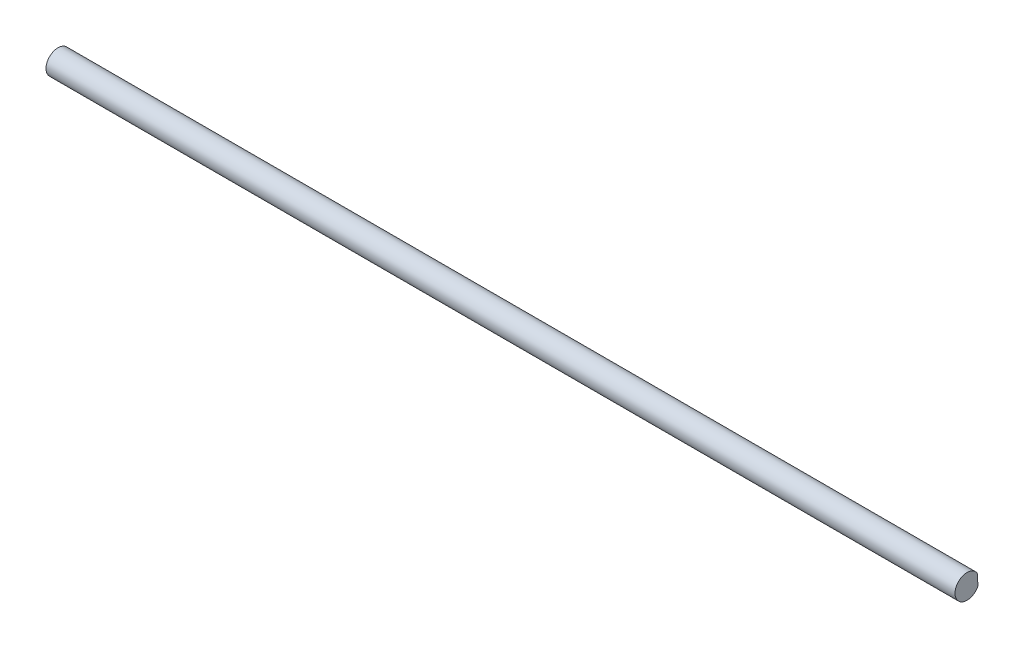
ISO-10303-21;
HEADER;
FILE_DESCRIPTION(('STEP AP214'),'2;1');
FILE_NAME('part.step','',(''),(''),'','','');
FILE_SCHEMA(('AUTOMOTIVE_DESIGN { 1 0 10303 214 1 1 1 1 }'));
ENDSEC;
DATA;
#1=APPLICATION_CONTEXT('core data for automotive mechanical design processes');
#2=APPLICATION_PROTOCOL_DEFINITION('international standard','automotive_design',2000,#1);
#3=PRODUCT_CONTEXT('',#1,'mechanical');
#4=PRODUCT('Part','Part','',(#3));
#5=PRODUCT_RELATED_PRODUCT_CATEGORY('part','',(#4));
#6=PRODUCT_DEFINITION_FORMATION('','',#4);
#7=PRODUCT_DEFINITION_CONTEXT('part definition',#1,'design');
#8=PRODUCT_DEFINITION('design','',#6,#7);
#9=PRODUCT_DEFINITION_SHAPE('','',#8);
#10=(LENGTH_UNIT() NAMED_UNIT(*) SI_UNIT(.MILLI.,.METRE.));
#11=(NAMED_UNIT(*) PLANE_ANGLE_UNIT() SI_UNIT($,.RADIAN.));
#12=(NAMED_UNIT(*) SI_UNIT($,.STERADIAN.) SOLID_ANGLE_UNIT());
#13=UNCERTAINTY_MEASURE_WITH_UNIT(LENGTH_MEASURE(1.E-05),#10,'distance_accuracy_value','');
#14=(GEOMETRIC_REPRESENTATION_CONTEXT(3) GLOBAL_UNCERTAINTY_ASSIGNED_CONTEXT((#13)) GLOBAL_UNIT_ASSIGNED_CONTEXT((#10,
#11,#12)) REPRESENTATION_CONTEXT('',''));
#15=CARTESIAN_POINT('',(0.,0.,0.));
#16=DIRECTION('',(0.,0.,1.));
#17=DIRECTION('',(1.,0.,0.));
#18=AXIS2_PLACEMENT_3D('',#15,#16,#17);
#19=CARTESIAN_POINT('',(240.,0.,0.));
#20=DIRECTION('',(-1.,0.,0.));
#21=DIRECTION('',(0.,0.,1.));
#22=AXIS2_PLACEMENT_3D('',#19,#20,#21);
#23=CYLINDRICAL_SURFACE('',#22,3.175);
#24=CARTESIAN_POINT('',(0.,0.,0.));
#25=DIRECTION('',(1.,0.,0.));
#26=DIRECTION('',(0.,0.,-1.));
#27=AXIS2_PLACEMENT_3D('',#24,#25,#26);
#28=CIRCLE('',#27,3.175);
#29=CARTESIAN_POINT('',(0.,1.69744000555634,-2.68315531185522));
#30=VERTEX_POINT('',#29);
#31=CARTESIAN_POINT('',(0.,-1.31143848976245,-2.89149685933939));
#32=VERTEX_POINT('',#31);
#33=EDGE_CURVE('E64',#30,#32,#28,.T.);
#34=ORIENTED_EDGE('',*,*,#33,.T.);
#35=DIRECTION('',(-1.,0.,0.));
#36=VECTOR('',#35,1.);
#37=CARTESIAN_POINT('',(240.,-1.31143848976245,-2.89149685933939));
#38=LINE('',#37,#36);
#39=CARTESIAN_POINT('',(240.,-1.31143848976245,-2.89149685933939));
#40=VERTEX_POINT('',#39);
#41=EDGE_CURVE('E11',#40,#32,#38,.T.);
#42=ORIENTED_EDGE('',*,*,#41,.F.);
#43=CARTESIAN_POINT('',(240.,0.,0.));
#44=DIRECTION('',(1.,0.,0.));
#45=DIRECTION('',(0.,0.,-1.));
#46=AXIS2_PLACEMENT_3D('',#43,#44,#45);
#47=CIRCLE('',#46,3.175);
#48=CARTESIAN_POINT('',(240.,1.69744000555634,-2.68315531185522));
#49=VERTEX_POINT('',#48);
#50=EDGE_CURVE('E63',#49,#40,#47,.T.);
#51=ORIENTED_EDGE('',*,*,#50,.F.);
#52=DIRECTION('',(-1.,0.,0.));
#53=VECTOR('',#52,1.);
#54=CARTESIAN_POINT('',(240.,1.69744000555634,-2.68315531185522));
#55=LINE('',#54,#53);
#56=EDGE_CURVE('E41',#49,#30,#55,.T.);
#57=ORIENTED_EDGE('',*,*,#56,.T.);
#58=EDGE_LOOP('',(#34,#42,#51,#57));
#59=FACE_BOUND('',#58,.T.);
#60=ADVANCED_FACE('F33',(#59),#23,.T.);
#61=CARTESIAN_POINT('',(240.,-1.31143848976245,-2.89149685933939));
#62=DIRECTION('',(0.,-0.0690768639573883,0.997611340586008));
#63=DIRECTION('',(0.,-0.997611340586008,-0.0690768639573883));
#64=AXIS2_PLACEMENT_3D('',#61,#62,#63);
#65=PLANE('',#64);
#66=DIRECTION('',(0.,0.997611340586008,0.0690768639573883));
#67=VECTOR('',#66,1.);
#68=CARTESIAN_POINT('',(0.,-1.31143848976245,-2.89149685933939));
#69=LINE('',#68,#67);
#70=EDGE_CURVE('E56',#32,#30,#69,.T.);
#71=ORIENTED_EDGE('',*,*,#70,.T.);
#72=ORIENTED_EDGE('',*,*,#56,.F.);
#73=DIRECTION('',(0.,0.997611340586008,0.0690768639573883));
#74=VECTOR('',#73,1.);
#75=CARTESIAN_POINT('',(240.,-1.31143848976245,-2.89149685933939));
#76=LINE('',#75,#74);
#77=EDGE_CURVE('E48',#40,#49,#76,.T.);
#78=ORIENTED_EDGE('',*,*,#77,.F.);
#79=ORIENTED_EDGE('',*,*,#41,.T.);
#80=EDGE_LOOP('',(#71,#72,#78,#79));
#81=FACE_BOUND('',#80,.T.);
#82=ADVANCED_FACE('F59',(#81),#65,.F.);
#83=CARTESIAN_POINT('',(240.,0.,0.));
#84=DIRECTION('',(1.,0.,0.));
#85=DIRECTION('',(0.,0.,-1.));
#86=AXIS2_PLACEMENT_3D('',#83,#84,#85);
#87=PLANE('',#86);
#88=ORIENTED_EDGE('',*,*,#50,.T.);
#89=ORIENTED_EDGE('',*,*,#77,.T.);
#90=EDGE_LOOP('',(#88,#89));
#91=FACE_BOUND('',#90,.T.);
#92=ADVANCED_FACE('F71',(#91),#87,.T.);
#93=CARTESIAN_POINT('',(0.,0.,0.));
#94=DIRECTION('',(1.,0.,0.));
#95=DIRECTION('',(0.,0.,-1.));
#96=AXIS2_PLACEMENT_3D('',#93,#94,#95);
#97=PLANE('',#96);
#98=ORIENTED_EDGE('',*,*,#33,.F.);
#99=ORIENTED_EDGE('',*,*,#70,.F.);
#100=EDGE_LOOP('',(#98,#99));
#101=FACE_BOUND('',#100,.T.);
#102=ADVANCED_FACE('F67',(#101),#97,.F.);
#103=CLOSED_SHELL('',(#60,#82,#92,#102));
#104=MANIFOLD_SOLID_BREP('B2',#103);
#105=ADVANCED_BREP_SHAPE_REPRESENTATION('',(#18,#104),#14);
#106=SHAPE_DEFINITION_REPRESENTATION(#9,#105);
ENDSEC;
END-ISO-10303-21;
